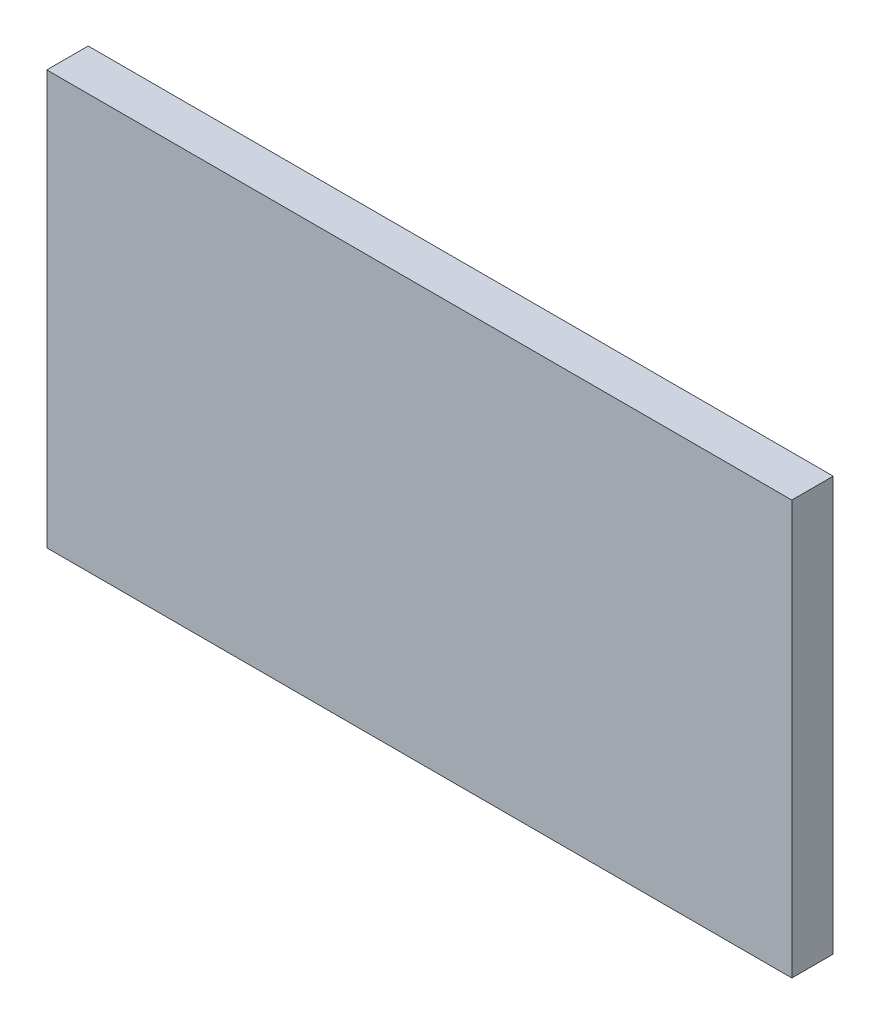
ISO-10303-21;
HEADER;
FILE_DESCRIPTION(('STEP AP214'),'2;1');
FILE_NAME('part.step','',(''),(''),'','','');
FILE_SCHEMA(('AUTOMOTIVE_DESIGN { 1 0 10303 214 1 1 1 1 }'));
ENDSEC;
DATA;
#1=APPLICATION_CONTEXT('core data for automotive mechanical design processes');
#2=APPLICATION_PROTOCOL_DEFINITION('international standard','automotive_design',2000,#1);
#3=PRODUCT_CONTEXT('',#1,'mechanical');
#4=PRODUCT('Part','Part','',(#3));
#5=PRODUCT_RELATED_PRODUCT_CATEGORY('part','',(#4));
#6=PRODUCT_DEFINITION_FORMATION('','',#4);
#7=PRODUCT_DEFINITION_CONTEXT('part definition',#1,'design');
#8=PRODUCT_DEFINITION('design','',#6,#7);
#9=PRODUCT_DEFINITION_SHAPE('','',#8);
#10=(LENGTH_UNIT() NAMED_UNIT(*) SI_UNIT(.MILLI.,.METRE.));
#11=(NAMED_UNIT(*) PLANE_ANGLE_UNIT() SI_UNIT($,.RADIAN.));
#12=(NAMED_UNIT(*) SI_UNIT($,.STERADIAN.) SOLID_ANGLE_UNIT());
#13=UNCERTAINTY_MEASURE_WITH_UNIT(LENGTH_MEASURE(1.E-05),#10,'distance_accuracy_value','');
#14=(GEOMETRIC_REPRESENTATION_CONTEXT(3) GLOBAL_UNCERTAINTY_ASSIGNED_CONTEXT((#13)) GLOBAL_UNIT_ASSIGNED_CONTEXT((#10,
#11,#12)) REPRESENTATION_CONTEXT('',''));
#15=CARTESIAN_POINT('',(0.,0.,0.));
#16=DIRECTION('',(0.,0.,1.));
#17=DIRECTION('',(1.,0.,0.));
#18=AXIS2_PLACEMENT_3D('',#15,#16,#17);
#19=CARTESIAN_POINT('',(57.15,0.,6.35));
#20=DIRECTION('',(-1.,0.,0.));
#21=DIRECTION('',(0.,0.,1.));
#22=AXIS2_PLACEMENT_3D('',#19,#20,#21);
#23=PLANE('',#22);
#24=DIRECTION('',(0.,1.,0.));
#25=VECTOR('',#24,1.);
#26=CARTESIAN_POINT('',(57.15,0.,0.));
#27=LINE('',#26,#25);
#28=CARTESIAN_POINT('',(57.15,0.,0.));
#29=VERTEX_POINT('',#28);
#30=CARTESIAN_POINT('',(57.15,63.5,0.));
#31=VERTEX_POINT('',#30);
#32=EDGE_CURVE('E107',#29,#31,#27,.T.);
#33=ORIENTED_EDGE('',*,*,#32,.T.);
#34=DIRECTION('',(0.,0.,-1.));
#35=VECTOR('',#34,1.);
#36=CARTESIAN_POINT('',(57.15,63.5,6.35));
#37=LINE('',#36,#35);
#38=CARTESIAN_POINT('',(57.15,63.5,6.35));
#39=VERTEX_POINT('',#38);
#40=EDGE_CURVE('E11',#39,#31,#37,.T.);
#41=ORIENTED_EDGE('',*,*,#40,.F.);
#42=DIRECTION('',(0.,1.,0.));
#43=VECTOR('',#42,1.);
#44=CARTESIAN_POINT('',(57.15,0.,6.35));
#45=LINE('',#44,#43);
#46=CARTESIAN_POINT('',(57.15,0.,6.35));
#47=VERTEX_POINT('',#46);
#48=EDGE_CURVE('E91',#47,#39,#45,.T.);
#49=ORIENTED_EDGE('',*,*,#48,.F.);
#50=DIRECTION('',(0.,0.,-1.));
#51=VECTOR('',#50,1.);
#52=CARTESIAN_POINT('',(57.15,0.,6.35));
#53=LINE('',#52,#51);
#54=EDGE_CURVE('E103',#47,#29,#53,.T.);
#55=ORIENTED_EDGE('',*,*,#54,.T.);
#56=EDGE_LOOP('',(#33,#41,#49,#55));
#57=FACE_BOUND('',#56,.T.);
#58=ADVANCED_FACE('F39',(#57),#23,.F.);
#59=CARTESIAN_POINT('',(57.15,63.5,6.35));
#60=DIRECTION('',(0.,-1.,0.));
#61=DIRECTION('',(0.,0.,-1.));
#62=AXIS2_PLACEMENT_3D('',#59,#60,#61);
#63=PLANE('',#62);
#64=DIRECTION('',(-1.,0.,0.));
#65=VECTOR('',#64,1.);
#66=CARTESIAN_POINT('',(57.15,63.5,0.));
#67=LINE('',#66,#65);
#68=CARTESIAN_POINT('',(-57.15,63.5,0.));
#69=VERTEX_POINT('',#68);
#70=EDGE_CURVE('E96',#31,#69,#67,.T.);
#71=ORIENTED_EDGE('',*,*,#70,.T.);
#72=DIRECTION('',(0.,0.,-1.));
#73=VECTOR('',#72,1.);
#74=CARTESIAN_POINT('',(-57.15,63.5,6.35));
#75=LINE('',#74,#73);
#76=CARTESIAN_POINT('',(-57.15,63.5,6.35));
#77=VERTEX_POINT('',#76);
#78=EDGE_CURVE('E48',#77,#69,#75,.T.);
#79=ORIENTED_EDGE('',*,*,#78,.F.);
#80=DIRECTION('',(-1.,0.,0.));
#81=VECTOR('',#80,1.);
#82=CARTESIAN_POINT('',(57.15,63.5,6.35));
#83=LINE('',#82,#81);
#84=EDGE_CURVE('E86',#39,#77,#83,.T.);
#85=ORIENTED_EDGE('',*,*,#84,.F.);
#86=ORIENTED_EDGE('',*,*,#40,.T.);
#87=EDGE_LOOP('',(#71,#79,#85,#86));
#88=FACE_BOUND('',#87,.T.);
#89=ADVANCED_FACE('F95',(#88),#63,.F.);
#90=CARTESIAN_POINT('',(-57.15,0.,6.35));
#91=DIRECTION('',(1.,0.,0.));
#92=DIRECTION('',(0.,0.,-1.));
#93=AXIS2_PLACEMENT_3D('',#90,#91,#92);
#94=PLANE('',#93);
#95=DIRECTION('',(0.,-1.,0.));
#96=VECTOR('',#95,1.);
#97=CARTESIAN_POINT('',(-57.15,0.,0.));
#98=LINE('',#97,#96);
#99=CARTESIAN_POINT('',(-57.15,0.,0.));
#100=VERTEX_POINT('',#99);
#101=EDGE_CURVE('E73',#69,#100,#98,.T.);
#102=ORIENTED_EDGE('',*,*,#101,.T.);
#103=DIRECTION('',(0.,0.,-1.));
#104=VECTOR('',#103,1.);
#105=CARTESIAN_POINT('',(-57.15,0.,6.35));
#106=LINE('',#105,#104);
#107=CARTESIAN_POINT('',(-57.15,0.,6.35));
#108=VERTEX_POINT('',#107);
#109=EDGE_CURVE('E98',#108,#100,#106,.T.);
#110=ORIENTED_EDGE('',*,*,#109,.F.);
#111=DIRECTION('',(0.,-1.,0.));
#112=VECTOR('',#111,1.);
#113=CARTESIAN_POINT('',(-57.15,0.,6.35));
#114=LINE('',#113,#112);
#115=EDGE_CURVE('E89',#77,#108,#114,.T.);
#116=ORIENTED_EDGE('',*,*,#115,.F.);
#117=ORIENTED_EDGE('',*,*,#78,.T.);
#118=EDGE_LOOP('',(#102,#110,#116,#117));
#119=FACE_BOUND('',#118,.T.);
#120=ADVANCED_FACE('F99',(#119),#94,.F.);
#121=CARTESIAN_POINT('',(-57.15,0.,6.35));
#122=DIRECTION('',(0.,1.,0.));
#123=DIRECTION('',(0.,0.,1.));
#124=AXIS2_PLACEMENT_3D('',#121,#122,#123);
#125=PLANE('',#124);
#126=DIRECTION('',(1.,0.,0.));
#127=VECTOR('',#126,1.);
#128=CARTESIAN_POINT('',(-57.15,0.,0.));
#129=LINE('',#128,#127);
#130=EDGE_CURVE('E79',#100,#29,#129,.T.);
#131=ORIENTED_EDGE('',*,*,#130,.T.);
#132=ORIENTED_EDGE('',*,*,#54,.F.);
#133=DIRECTION('',(1.,0.,0.));
#134=VECTOR('',#133,1.);
#135=CARTESIAN_POINT('',(-57.15,0.,6.35));
#136=LINE('',#135,#134);
#137=EDGE_CURVE('E56',#108,#47,#136,.T.);
#138=ORIENTED_EDGE('',*,*,#137,.F.);
#139=ORIENTED_EDGE('',*,*,#109,.T.);
#140=EDGE_LOOP('',(#131,#132,#138,#139));
#141=FACE_BOUND('',#140,.T.);
#142=ADVANCED_FACE('F120',(#141),#125,.F.);
#143=CARTESIAN_POINT('',(0.,0.,6.35));
#144=DIRECTION('',(0.,0.,1.));
#145=DIRECTION('',(1.,0.,0.));
#146=AXIS2_PLACEMENT_3D('',#143,#144,#145);
#147=PLANE('',#146);
#148=ORIENTED_EDGE('',*,*,#48,.T.);
#149=ORIENTED_EDGE('',*,*,#84,.T.);
#150=ORIENTED_EDGE('',*,*,#115,.T.);
#151=ORIENTED_EDGE('',*,*,#137,.T.);
#152=EDGE_LOOP('',(#148,#149,#150,#151));
#153=FACE_BOUND('',#152,.T.);
#154=ADVANCED_FACE('F87',(#153),#147,.T.);
#155=CARTESIAN_POINT('',(0.,0.,0.));
#156=DIRECTION('',(0.,0.,1.));
#157=DIRECTION('',(1.,0.,0.));
#158=AXIS2_PLACEMENT_3D('',#155,#156,#157);
#159=PLANE('',#158);
#160=ORIENTED_EDGE('',*,*,#32,.F.);
#161=ORIENTED_EDGE('',*,*,#130,.F.);
#162=ORIENTED_EDGE('',*,*,#101,.F.);
#163=ORIENTED_EDGE('',*,*,#70,.F.);
#164=EDGE_LOOP('',(#160,#161,#162,#163));
#165=FACE_BOUND('',#164,.T.);
#166=ADVANCED_FACE('F123',(#165),#159,.F.);
#167=CLOSED_SHELL('',(#58,#89,#120,#142,#154,#166));
#168=MANIFOLD_SOLID_BREP('B2',#167);
#169=ADVANCED_BREP_SHAPE_REPRESENTATION('',(#18,#168),#14);
#170=SHAPE_DEFINITION_REPRESENTATION(#9,#169);
ENDSEC;
END-ISO-10303-21;
